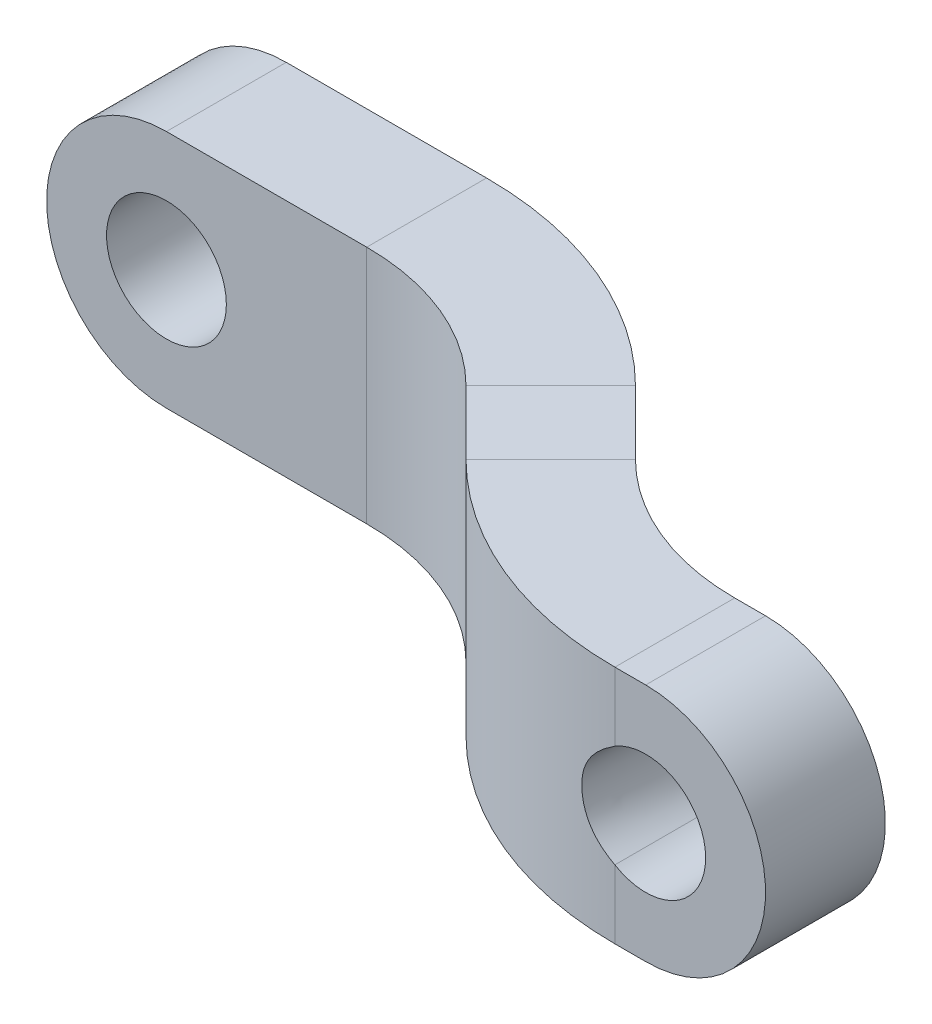
ISO-10303-21;
HEADER;
FILE_DESCRIPTION(('STEP AP214'),'2;1');
FILE_NAME('part.step','',(''),(''),'','','');
FILE_SCHEMA(('AUTOMOTIVE_DESIGN { 1 0 10303 214 1 1 1 1 }'));
ENDSEC;
DATA;
#1=APPLICATION_CONTEXT('core data for automotive mechanical design processes');
#2=APPLICATION_PROTOCOL_DEFINITION('international standard','automotive_design',2000,#1);
#3=PRODUCT_CONTEXT('',#1,'mechanical');
#4=PRODUCT('Part','Part','',(#3));
#5=PRODUCT_RELATED_PRODUCT_CATEGORY('part','',(#4));
#6=PRODUCT_DEFINITION_FORMATION('','',#4);
#7=PRODUCT_DEFINITION_CONTEXT('part definition',#1,'design');
#8=PRODUCT_DEFINITION('design','',#6,#7);
#9=PRODUCT_DEFINITION_SHAPE('','',#8);
#10=(LENGTH_UNIT() NAMED_UNIT(*) SI_UNIT(.MILLI.,.METRE.));
#11=(NAMED_UNIT(*) PLANE_ANGLE_UNIT() SI_UNIT($,.RADIAN.));
#12=(NAMED_UNIT(*) SI_UNIT($,.STERADIAN.) SOLID_ANGLE_UNIT());
#13=UNCERTAINTY_MEASURE_WITH_UNIT(LENGTH_MEASURE(1.E-05),#10,'distance_accuracy_value','');
#14=(GEOMETRIC_REPRESENTATION_CONTEXT(3) GLOBAL_UNCERTAINTY_ASSIGNED_CONTEXT((#13)) GLOBAL_UNIT_ASSIGNED_CONTEXT((#10,
#11,#12)) REPRESENTATION_CONTEXT('',''));
#15=CARTESIAN_POINT('',(0.,0.,0.));
#16=DIRECTION('',(0.,0.,1.));
#17=DIRECTION('',(1.,0.,0.));
#18=AXIS2_PLACEMENT_3D('',#15,#16,#17);
#19=CARTESIAN_POINT('',(2.57702502056479,0.,-4.92297497943529));
#20=DIRECTION('',(-0.707106781186549,0.,0.707106781186546));
#21=DIRECTION('',(0.707106781186546,0.,0.707106781186549));
#22=AXIS2_PLACEMENT_3D('',#19,#20,#21);
#23=PLANE('',#22);
#24=DIRECTION('',(0.707106781186546,0.,0.707106781186549));
#25=VECTOR('',#24,1.);
#26=CARTESIAN_POINT('',(2.57702502056479,-5.,-4.92297497943529));
#27=LINE('',#26,#25);
#28=CARTESIAN_POINT('',(15.4289321881346,-5.,7.92893218813454));
#29=VERTEX_POINT('',#28);
#30=CARTESIAN_POINT('',(18.1066017177983,-5.,10.6066017177983));
#31=VERTEX_POINT('',#30);
#32=EDGE_CURVE('E363',#29,#31,#27,.T.);
#33=ORIENTED_EDGE('',*,*,#32,.T.);
#34=DIRECTION('',(0.,1.,0.));
#35=VECTOR('',#34,1.);
#36=CARTESIAN_POINT('',(18.1066017177983,0.,10.6066017177983));
#37=LINE('',#36,#35);
#38=CARTESIAN_POINT('',(18.1066017177983,5.,10.6066017177983));
#39=VERTEX_POINT('',#38);
#40=EDGE_CURVE('E355',#31,#39,#37,.T.);
#41=ORIENTED_EDGE('',*,*,#40,.T.);
#42=DIRECTION('',(-0.707106781186546,0.,-0.707106781186549));
#43=VECTOR('',#42,1.);
#44=CARTESIAN_POINT('',(2.57702502056479,5.,-4.92297497943529));
#45=LINE('',#44,#43);
#46=CARTESIAN_POINT('',(15.4289321881346,5.,7.92893218813454));
#47=VERTEX_POINT('',#46);
#48=EDGE_CURVE('E347',#39,#47,#45,.T.);
#49=ORIENTED_EDGE('',*,*,#48,.T.);
#50=DIRECTION('',(0.,1.,0.));
#51=VECTOR('',#50,1.);
#52=CARTESIAN_POINT('',(15.4289321881346,0.,7.92893218813454));
#53=LINE('',#52,#51);
#54=EDGE_CURVE('E343',#29,#47,#53,.T.);
#55=ORIENTED_EDGE('',*,*,#54,.F.);
#56=EDGE_LOOP('',(#33,#41,#49,#55));
#57=FACE_BOUND('',#56,.T.);
#58=ADVANCED_FACE('F50',(#57),#23,.T.);
#59=CARTESIAN_POINT('',(2.57702502056479,-5.,-4.92297497943529));
#60=DIRECTION('',(0.,-1.,0.));
#61=DIRECTION('',(0.707106781186546,0.,0.707106781186549));
#62=AXIS2_PLACEMENT_3D('',#59,#60,#61);
#63=PLANE('',#62);
#64=DIRECTION('',(0.707106781186546,0.,0.707106781186549));
#65=VECTOR('',#64,1.);
#66=CARTESIAN_POINT('',(6.11255892649753,-5.,-8.45850888536802));
#67=LINE('',#66,#65);
#68=CARTESIAN_POINT('',(18.9644660940673,-5.,4.39339828220181));
#69=VERTEX_POINT('',#68);
#70=CARTESIAN_POINT('',(21.642135623731,-5.,7.07106781186553));
#71=VERTEX_POINT('',#70);
#72=EDGE_CURVE('E73',#69,#71,#67,.T.);
#73=ORIENTED_EDGE('',*,*,#72,.T.);
#74=DIRECTION('',(-0.707106781186549,0.,0.707106781186546));
#75=VECTOR('',#74,1.);
#76=CARTESIAN_POINT('',(18.1066017177983,-5.,10.6066017177983));
#77=LINE('',#76,#75);
#78=EDGE_CURVE('E358',#71,#31,#77,.T.);
#79=ORIENTED_EDGE('',*,*,#78,.T.);
#80=ORIENTED_EDGE('',*,*,#32,.F.);
#81=DIRECTION('',(-0.707106781186549,0.,0.707106781186546));
#82=VECTOR('',#81,1.);
#83=CARTESIAN_POINT('',(15.4289321881346,-5.,7.92893218813454));
#84=LINE('',#83,#82);
#85=EDGE_CURVE('E352',#69,#29,#84,.T.);
#86=ORIENTED_EDGE('',*,*,#85,.F.);
#87=EDGE_LOOP('',(#73,#79,#80,#86));
#88=FACE_BOUND('',#87,.T.);
#89=ADVANCED_FACE('F52',(#88),#63,.T.);
#90=CARTESIAN_POINT('',(2.57702502056479,5.,-4.92297497943529));
#91=DIRECTION('',(0.,1.,0.));
#92=DIRECTION('',(-0.707106781186546,0.,-0.707106781186549));
#93=AXIS2_PLACEMENT_3D('',#90,#91,#92);
#94=PLANE('',#93);
#95=ORIENTED_EDGE('',*,*,#48,.F.);
#96=DIRECTION('',(0.707106781186549,0.,-0.707106781186546));
#97=VECTOR('',#96,1.);
#98=CARTESIAN_POINT('',(18.1066017177983,5.,10.6066017177983));
#99=LINE('',#98,#97);
#100=CARTESIAN_POINT('',(21.642135623731,5.,7.07106781186552));
#101=VERTEX_POINT('',#100);
#102=EDGE_CURVE('E12',#39,#101,#99,.T.);
#103=ORIENTED_EDGE('',*,*,#102,.T.);
#104=DIRECTION('',(0.707106781186546,0.,0.707106781186549));
#105=VECTOR('',#104,1.);
#106=CARTESIAN_POINT('',(6.11255892649753,5.,-8.45850888536802));
#107=LINE('',#106,#105);
#108=CARTESIAN_POINT('',(18.9644660940673,5.,4.39339828220181));
#109=VERTEX_POINT('',#108);
#110=EDGE_CURVE('E308',#101,#109,#107,.F.);
#111=ORIENTED_EDGE('',*,*,#110,.T.);
#112=DIRECTION('',(0.707106781186549,0.,-0.707106781186546));
#113=VECTOR('',#112,1.);
#114=CARTESIAN_POINT('',(15.4289321881346,5.,7.92893218813454));
#115=LINE('',#114,#113);
#116=EDGE_CURVE('E346',#47,#109,#115,.T.);
#117=ORIENTED_EDGE('',*,*,#116,.F.);
#118=EDGE_LOOP('',(#95,#103,#111,#117));
#119=FACE_BOUND('',#118,.T.);
#120=ADVANCED_FACE('F440',(#119),#94,.T.);
#121=CARTESIAN_POINT('',(6.11255892649753,0.,-8.45850888536802));
#122=DIRECTION('',(-0.707106781186549,0.,0.707106781186546));
#123=DIRECTION('',(0.707106781186546,0.,0.707106781186549));
#124=AXIS2_PLACEMENT_3D('',#121,#122,#123);
#125=PLANE('',#124);
#126=DIRECTION('',(0.,1.,0.));
#127=VECTOR('',#126,1.);
#128=CARTESIAN_POINT('',(21.642135623731,0.,7.07106781186553));
#129=LINE('',#128,#127);
#130=EDGE_CURVE('E59',#71,#101,#129,.T.);
#131=ORIENTED_EDGE('',*,*,#130,.F.);
#132=ORIENTED_EDGE('',*,*,#72,.F.);
#133=DIRECTION('',(0.,1.,0.));
#134=VECTOR('',#133,1.);
#135=CARTESIAN_POINT('',(18.9644660940673,0.,4.39339828220181));
#136=LINE('',#135,#134);
#137=EDGE_CURVE('E350',#69,#109,#136,.T.);
#138=ORIENTED_EDGE('',*,*,#137,.T.);
#139=ORIENTED_EDGE('',*,*,#110,.F.);
#140=EDGE_LOOP('',(#131,#132,#138,#139));
#141=FACE_BOUND('',#140,.T.);
#142=ADVANCED_FACE('F437',(#141),#125,.F.);
#143=CARTESIAN_POINT('',(0.,0.,5.));
#144=DIRECTION('',(0.,0.,1.));
#145=DIRECTION('',(1.,0.,0.));
#146=AXIS2_PLACEMENT_3D('',#143,#144,#145);
#147=CYLINDRICAL_SURFACE('',#146,5.);
#148=DIRECTION('',(0.,0.,1.));
#149=VECTOR('',#148,1.);
#150=CARTESIAN_POINT('',(0.,5.,5.));
#151=LINE('',#150,#149);
#152=CARTESIAN_POINT('',(0.,5.,0.));
#153=VERTEX_POINT('',#152);
#154=CARTESIAN_POINT('',(0.,5.,5.));
#155=VERTEX_POINT('',#154);
#156=EDGE_CURVE('E315',#153,#155,#151,.T.);
#157=ORIENTED_EDGE('',*,*,#156,.F.);
#158=CARTESIAN_POINT('',(0.,0.,0.));
#159=DIRECTION('',(0.,0.,1.));
#160=DIRECTION('',(1.,0.,0.));
#161=AXIS2_PLACEMENT_3D('',#158,#159,#160);
#162=CIRCLE('',#161,5.);
#163=CARTESIAN_POINT('',(0.,-5.,0.));
#164=VERTEX_POINT('',#163);
#165=EDGE_CURVE('E339',#153,#164,#162,.T.);
#166=ORIENTED_EDGE('',*,*,#165,.T.);
#167=DIRECTION('',(0.,0.,1.));
#168=VECTOR('',#167,1.);
#169=CARTESIAN_POINT('',(0.,-5.,5.));
#170=LINE('',#169,#168);
#171=CARTESIAN_POINT('',(0.,-5.,5.));
#172=VERTEX_POINT('',#171);
#173=EDGE_CURVE('E337',#164,#172,#170,.T.);
#174=ORIENTED_EDGE('',*,*,#173,.T.);
#175=CARTESIAN_POINT('',(0.,0.,5.));
#176=DIRECTION('',(0.,0.,1.));
#177=DIRECTION('',(1.,0.,0.));
#178=AXIS2_PLACEMENT_3D('',#175,#176,#177);
#179=CIRCLE('',#178,5.);
#180=EDGE_CURVE('E323',#155,#172,#179,.T.);
#181=ORIENTED_EDGE('',*,*,#180,.F.);
#182=EDGE_LOOP('',(#157,#166,#174,#181));
#183=FACE_BOUND('',#182,.T.);
#184=ADVANCED_FACE('F471',(#183),#147,.T.);
#185=CARTESIAN_POINT('',(0.,0.,5.));
#186=DIRECTION('',(0.,0.,1.));
#187=DIRECTION('',(1.,0.,0.));
#188=AXIS2_PLACEMENT_3D('',#185,#186,#187);
#189=CYLINDRICAL_SURFACE('',#188,2.5);
#190=CARTESIAN_POINT('',(0.,0.,5.));
#191=DIRECTION('',(0.,0.,1.));
#192=DIRECTION('',(1.,0.,0.));
#193=AXIS2_PLACEMENT_3D('',#190,#191,#192);
#194=CIRCLE('',#193,2.5);
#195=CARTESIAN_POINT('',(2.5,0.,5.));
#196=VERTEX_POINT('',#195);
#197=EDGE_CURVE('E334',#196,#196,#194,.T.);
#198=ORIENTED_EDGE('',*,*,#197,.T.);
#199=EDGE_LOOP('',(#198));
#200=FACE_BOUND('',#199,.T.);
#201=CARTESIAN_POINT('',(0.,0.,0.));
#202=DIRECTION('',(0.,0.,1.));
#203=DIRECTION('',(1.,0.,0.));
#204=AXIS2_PLACEMENT_3D('',#201,#202,#203);
#205=CIRCLE('',#204,2.5);
#206=CARTESIAN_POINT('',(2.5,0.,0.));
#207=VERTEX_POINT('',#206);
#208=EDGE_CURVE('E312',#207,#207,#205,.T.);
#209=ORIENTED_EDGE('',*,*,#208,.F.);
#210=EDGE_LOOP('',(#209));
#211=FACE_BOUND('',#210,.T.);
#212=ADVANCED_FACE('F473',(#200,#211),#189,.F.);
#213=CARTESIAN_POINT('',(0.,0.,5.));
#214=DIRECTION('',(0.,0.,1.));
#215=DIRECTION('',(1.,0.,0.));
#216=AXIS2_PLACEMENT_3D('',#213,#214,#215);
#217=PLANE('',#216);
#218=ORIENTED_EDGE('',*,*,#197,.F.);
#219=EDGE_LOOP('',(#218));
#220=FACE_BOUND('',#219,.T.);
#221=DIRECTION('',(1.,0.,0.));
#222=VECTOR('',#221,1.);
#223=CARTESIAN_POINT('',(0.,-5.,5.));
#224=LINE('',#223,#222);
#225=CARTESIAN_POINT('',(8.35786437626909,-5.,5.));
#226=VERTEX_POINT('',#225);
#227=EDGE_CURVE('E331',#172,#226,#224,.T.);
#228=ORIENTED_EDGE('',*,*,#227,.T.);
#229=DIRECTION('',(0.,1.,0.));
#230=VECTOR('',#229,1.);
#231=CARTESIAN_POINT('',(8.35786437626908,0.,5.));
#232=LINE('',#231,#230);
#233=CARTESIAN_POINT('',(8.35786437626908,5.,5.));
#234=VERTEX_POINT('',#233);
#235=EDGE_CURVE('E328',#226,#234,#232,.T.);
#236=ORIENTED_EDGE('',*,*,#235,.T.);
#237=DIRECTION('',(-1.,0.,0.));
#238=VECTOR('',#237,1.);
#239=CARTESIAN_POINT('',(0.,5.,5.));
#240=LINE('',#239,#238);
#241=EDGE_CURVE('E326',#234,#155,#240,.T.);
#242=ORIENTED_EDGE('',*,*,#241,.T.);
#243=ORIENTED_EDGE('',*,*,#180,.T.);
#244=EDGE_LOOP('',(#228,#236,#242,#243));
#245=FACE_BOUND('',#244,.T.);
#246=ADVANCED_FACE('F455',(#220,#245),#217,.T.);
#247=CARTESIAN_POINT('',(0.,5.,5.));
#248=DIRECTION('',(0.,1.,0.));
#249=DIRECTION('',(-1.,0.,0.));
#250=AXIS2_PLACEMENT_3D('',#247,#248,#249);
#251=PLANE('',#250);
#252=ORIENTED_EDGE('',*,*,#241,.F.);
#253=DIRECTION('',(0.,0.,-1.));
#254=VECTOR('',#253,1.);
#255=CARTESIAN_POINT('',(8.35786437626908,5.,5.));
#256=LINE('',#255,#254);
#257=CARTESIAN_POINT('',(8.35786437626908,5.,0.));
#258=VERTEX_POINT('',#257);
#259=EDGE_CURVE('E320',#234,#258,#256,.T.);
#260=ORIENTED_EDGE('',*,*,#259,.T.);
#261=DIRECTION('',(1.,0.,0.));
#262=VECTOR('',#261,1.);
#263=CARTESIAN_POINT('',(0.,5.,0.));
#264=LINE('',#263,#262);
#265=EDGE_CURVE('E318',#258,#153,#264,.F.);
#266=ORIENTED_EDGE('',*,*,#265,.T.);
#267=ORIENTED_EDGE('',*,*,#156,.T.);
#268=EDGE_LOOP('',(#252,#260,#266,#267));
#269=FACE_BOUND('',#268,.T.);
#270=ADVANCED_FACE('F451',(#269),#251,.T.);
#271=CARTESIAN_POINT('',(0.,0.,0.));
#272=DIRECTION('',(0.,0.,1.));
#273=DIRECTION('',(1.,0.,0.));
#274=AXIS2_PLACEMENT_3D('',#271,#272,#273);
#275=PLANE('',#274);
#276=DIRECTION('',(0.,1.,0.));
#277=VECTOR('',#276,1.);
#278=CARTESIAN_POINT('',(8.35786437626908,0.,0.));
#279=LINE('',#278,#277);
#280=CARTESIAN_POINT('',(8.35786437626909,-5.,0.));
#281=VERTEX_POINT('',#280);
#282=EDGE_CURVE('E300',#281,#258,#279,.T.);
#283=ORIENTED_EDGE('',*,*,#282,.F.);
#284=DIRECTION('',(1.,0.,0.));
#285=VECTOR('',#284,1.);
#286=CARTESIAN_POINT('',(0.,-5.,0.));
#287=LINE('',#286,#285);
#288=EDGE_CURVE('E309',#164,#281,#287,.T.);
#289=ORIENTED_EDGE('',*,*,#288,.F.);
#290=ORIENTED_EDGE('',*,*,#165,.F.);
#291=ORIENTED_EDGE('',*,*,#265,.F.);
#292=EDGE_LOOP('',(#283,#289,#290,#291));
#293=FACE_BOUND('',#292,.T.);
#294=ORIENTED_EDGE('',*,*,#208,.T.);
#295=EDGE_LOOP('',(#294));
#296=FACE_BOUND('',#295,.T.);
#297=ADVANCED_FACE('F467',(#293,#296),#275,.F.);
#298=CARTESIAN_POINT('',(0.,-5.,5.));
#299=DIRECTION('',(0.,-1.,0.));
#300=DIRECTION('',(1.,0.,0.));
#301=AXIS2_PLACEMENT_3D('',#298,#299,#300);
#302=PLANE('',#301);
#303=ORIENTED_EDGE('',*,*,#288,.T.);
#304=DIRECTION('',(0.,0.,1.));
#305=VECTOR('',#304,1.);
#306=CARTESIAN_POINT('',(8.35786437626908,-5.,5.));
#307=LINE('',#306,#305);
#308=EDGE_CURVE('E305',#281,#226,#307,.T.);
#309=ORIENTED_EDGE('',*,*,#308,.T.);
#310=ORIENTED_EDGE('',*,*,#227,.F.);
#311=ORIENTED_EDGE('',*,*,#173,.F.);
#312=EDGE_LOOP('',(#303,#309,#310,#311));
#313=FACE_BOUND('',#312,.T.);
#314=ADVANCED_FACE('F458',(#313),#302,.T.);
#315=CARTESIAN_POINT('',(8.35786437626908,-5.,15.));
#316=DIRECTION('',(0.,1.,0.));
#317=DIRECTION('',(0.,0.,1.));
#318=AXIS2_PLACEMENT_3D('',#315,#316,#317);
#319=PLANE('',#318);
#320=ORIENTED_EDGE('',*,*,#308,.F.);
#321=CARTESIAN_POINT('',(8.35786437626908,-5.,15.));
#322=DIRECTION('',(0.,1.,0.));
#323=DIRECTION('',(-1.,0.,0.));
#324=AXIS2_PLACEMENT_3D('',#321,#322,#323);
#325=CIRCLE('',#324,15.);
#326=EDGE_CURVE('E203',#281,#69,#325,.F.);
#327=ORIENTED_EDGE('',*,*,#326,.T.);
#328=ORIENTED_EDGE('',*,*,#85,.T.);
#329=CARTESIAN_POINT('',(8.35786437626908,-5.,15.));
#330=DIRECTION('',(0.,-1.,0.));
#331=DIRECTION('',(0.,0.,-1.));
#332=AXIS2_PLACEMENT_3D('',#329,#330,#331);
#333=CIRCLE('',#332,10.);
#334=EDGE_CURVE('E288',#226,#29,#333,.T.);
#335=ORIENTED_EDGE('',*,*,#334,.F.);
#336=EDGE_LOOP('',(#320,#327,#328,#335));
#337=FACE_BOUND('',#336,.T.);
#338=ADVANCED_FACE('F463',(#337),#319,.F.);
#339=CARTESIAN_POINT('',(8.35786437626908,5.,15.));
#340=DIRECTION('',(0.,-1.,0.));
#341=DIRECTION('',(0.,0.,-1.));
#342=AXIS2_PLACEMENT_3D('',#339,#340,#341);
#343=PLANE('',#342);
#344=ORIENTED_EDGE('',*,*,#116,.T.);
#345=CARTESIAN_POINT('',(8.35786437626908,5.,15.));
#346=DIRECTION('',(0.,1.,0.));
#347=DIRECTION('',(-1.,0.,0.));
#348=AXIS2_PLACEMENT_3D('',#345,#346,#347);
#349=CIRCLE('',#348,15.);
#350=EDGE_CURVE('E297',#109,#258,#349,.T.);
#351=ORIENTED_EDGE('',*,*,#350,.T.);
#352=ORIENTED_EDGE('',*,*,#259,.F.);
#353=CARTESIAN_POINT('',(8.35786437626908,5.,15.));
#354=DIRECTION('',(0.,1.,0.));
#355=DIRECTION('',(0.,0.,1.));
#356=AXIS2_PLACEMENT_3D('',#353,#354,#355);
#357=CIRCLE('',#356,10.);
#358=EDGE_CURVE('E296',#47,#234,#357,.T.);
#359=ORIENTED_EDGE('',*,*,#358,.F.);
#360=EDGE_LOOP('',(#344,#351,#352,#359));
#361=FACE_BOUND('',#360,.T.);
#362=ADVANCED_FACE('F446',(#361),#343,.F.);
#363=CARTESIAN_POINT('',(8.35786437626908,-14.8789399985143,15.));
#364=DIRECTION('',(0.,1.,0.));
#365=DIRECTION('',(-1.,0.,0.));
#366=AXIS2_PLACEMENT_3D('',#363,#364,#365);
#367=CYLINDRICAL_SURFACE('',#366,10.);
#368=ORIENTED_EDGE('',*,*,#358,.T.);
#369=ORIENTED_EDGE('',*,*,#235,.F.);
#370=ORIENTED_EDGE('',*,*,#334,.T.);
#371=ORIENTED_EDGE('',*,*,#54,.T.);
#372=EDGE_LOOP('',(#368,#369,#370,#371));
#373=FACE_BOUND('',#372,.T.);
#374=ADVANCED_FACE('F443',(#373),#367,.F.);
#375=CARTESIAN_POINT('',(8.35786437626908,-14.8789399985143,15.));
#376=DIRECTION('',(0.,1.,0.));
#377=DIRECTION('',(-1.,0.,0.));
#378=AXIS2_PLACEMENT_3D('',#375,#376,#377);
#379=CYLINDRICAL_SURFACE('',#378,15.);
#380=ORIENTED_EDGE('',*,*,#350,.F.);
#381=ORIENTED_EDGE('',*,*,#137,.F.);
#382=ORIENTED_EDGE('',*,*,#326,.F.);
#383=ORIENTED_EDGE('',*,*,#282,.T.);
#384=EDGE_LOOP('',(#380,#381,#382,#383));
#385=FACE_BOUND('',#384,.T.);
#386=ADVANCED_FACE('F465',(#385),#379,.T.);
#387=CARTESIAN_POINT('',(28.7132034355965,-5.,0.));
#388=DIRECTION('',(0.,-1.,0.));
#389=DIRECTION('',(0.,0.,-1.));
#390=AXIS2_PLACEMENT_3D('',#387,#388,#389);
#391=PLANE('',#390);
#392=ORIENTED_EDGE('',*,*,#78,.F.);
#393=CARTESIAN_POINT('',(28.7132034355965,-5.,0.));
#394=DIRECTION('',(0.,1.,0.));
#395=DIRECTION('',(-1.,0.,0.));
#396=AXIS2_PLACEMENT_3D('',#393,#394,#395);
#397=CIRCLE('',#396,10.);
#398=CARTESIAN_POINT('',(28.7132034355965,-5.,10.0000000000001));
#399=VERTEX_POINT('',#398);
#400=EDGE_CURVE('E176',#71,#399,#397,.T.);
#401=ORIENTED_EDGE('',*,*,#400,.T.);
#402=DIRECTION('',(0.,0.,1.));
#403=VECTOR('',#402,1.);
#404=CARTESIAN_POINT('',(28.7132034355965,-5.,15.0000000000001));
#405=LINE('',#404,#403);
#406=CARTESIAN_POINT('',(28.7132034355965,-5.,15.0000000000001));
#407=VERTEX_POINT('',#406);
#408=EDGE_CURVE('E162',#399,#407,#405,.T.);
#409=ORIENTED_EDGE('',*,*,#408,.T.);
#410=CARTESIAN_POINT('',(28.7132034355965,-5.,0.));
#411=DIRECTION('',(0.,1.,0.));
#412=DIRECTION('',(0.,0.,1.));
#413=AXIS2_PLACEMENT_3D('',#410,#411,#412);
#414=CIRCLE('',#413,15.);
#415=EDGE_CURVE('E195',#31,#407,#414,.T.);
#416=ORIENTED_EDGE('',*,*,#415,.F.);
#417=EDGE_LOOP('',(#392,#401,#409,#416));
#418=FACE_BOUND('',#417,.T.);
#419=ADVANCED_FACE('F262',(#418),#391,.T.);
#420=CARTESIAN_POINT('',(28.7132034355965,-2.14339791029087,15.0000000000001));
#421=CARTESIAN_POINT('',(28.2275167462207,-1.89037995575477,15.0000000000001));
#422=CARTESIAN_POINT('',(27.8639054932689,-1.58544875984548,14.9778990853626));
#423=CARTESIAN_POINT('',(27.501237034779,-1.04999394436314,14.9514490750839));
#424=CARTESIAN_POINT('',(27.4107703328523,-0.858509788908112,14.9434707445677));
#425=CARTESIAN_POINT('',(27.3205236395993,-0.55178473028418,14.9352387143976));
#426=CARTESIAN_POINT('',(27.2980173702974,-0.446293239835975,14.9330999341023));
#427=CARTESIAN_POINT('',(27.2756078598306,-0.283181297803318,14.9309535954964));
#428=CARTESIAN_POINT('',(27.2700297570161,-0.22799819939904,14.9304140416442));
#429=CARTESIAN_POINT('',(27.2644992901052,-0.144004875202539,14.9298780882232));
#430=CARTESIAN_POINT('',(27.2631285886024,-0.115803987705358,14.9297449325851));
#431=CARTESIAN_POINT('',(27.2613326848163,-0.0589959871809667,14.9295703935835));
#432=CARTESIAN_POINT('',(27.2609128816966,-0.0271165503110795,14.9295295354156));
#433=CARTESIAN_POINT('',(27.2616291993632,0.407027782831231,14.9295992141627));
#434=CARTESIAN_POINT('',(27.3825015749911,0.790079044981979,14.9428243837746));
#435=CARTESIAN_POINT('',(27.8660645983879,1.50507123119944,14.9780213578643));
#436=CARTESIAN_POINT('',(28.2289663271761,1.83696646358107,15.0000000000001));
#437=CARTESIAN_POINT('',(28.7132034355965,2.14339791029086,15.0000000000001));
#438=CARTESIAN_POINT('',(28.7132034355965,-2.14339791029088,10.0000000000001));
#439=CARTESIAN_POINT('',(28.3894235796052,-1.89038876259876,10.0000000000001));
#440=CARTESIAN_POINT('',(28.1470048073781,-1.58544875984548,9.98526605690842));
#441=CARTESIAN_POINT('',(27.9052258350515,-1.04999394436315,9.96763271672263));
#442=CARTESIAN_POINT('',(27.8449147004337,-0.858509788908113,9.96231382971182));
#443=CARTESIAN_POINT('',(27.784750238265,-0.551784730284181,9.95682580959843));
#444=CARTESIAN_POINT('',(27.7697460587304,-0.446293239835976,9.95539995606824));
#445=CARTESIAN_POINT('',(27.7548063850859,-0.283181297803319,9.95396906366426));
#446=CARTESIAN_POINT('',(27.7510876498762,-0.227998199399042,9.95360936109615));
#447=CARTESIAN_POINT('',(27.7474006719356,-0.14400487520254,9.95325205881546));
#448=CARTESIAN_POINT('',(27.7464868709338,-0.115803987705359,9.95316328839009));
#449=CARTESIAN_POINT('',(27.745289601743,-0.0589959871809679,9.95304692905567));
#450=CARTESIAN_POINT('',(27.7450097329965,-0.0271165503110807,9.9530196902771));
#451=CARTESIAN_POINT('',(27.7454872781076,0.40702778283123,9.95306614277514));
#452=CARTESIAN_POINT('',(27.8260688618596,0.790079044981978,9.96188292251642));
#453=CARTESIAN_POINT('',(28.1484442107908,1.50507123119944,9.98534757190958));
#454=CARTESIAN_POINT('',(28.3903913715677,1.83697849485699,10.0000000000001));
#455=CARTESIAN_POINT('',(28.7132034355965,2.14339791029086,10.0000000000001));
#456=B_SPLINE_SURFACE_WITH_KNOTS('',1,3,((#420,#421,#422,#423,#424,#425,#426,#427,#428,#429,
#430,#431,#432,#433,#434,#435,#436,#437),(#438,#439,#440,#441,#442,#443,#444,#445,#446,#447,
#448,#449,#450,#451,#452,#453,#454,#455)),.UNSPECIFIED.,.F.,.F.,.F.,(2,2),(4,2,2,2,2,2,2,2,4),
(0.,1.),(0.,0.25,0.375,0.4375,0.46875,0.484375,0.5,0.75,1.),.UNSPECIFIED.);
#457=CARTESIAN_POINT('',(28.7132034355965,-2.14339791029087,15.0000000000001));
#458=CARTESIAN_POINT('',(28.7132034355965,-2.14339791029088,10.0000000000001));
#459=B_SPLINE_CURVE_WITH_KNOTS('',1,(#457,#458),.UNSPECIFIED.,.F.,.F.,(2,2),(0.,1.),.UNSPECIFIED.);
#460=CARTESIAN_POINT('',(28.7132034355965,-2.14339791029087,15.0000000000001));
#461=VERTEX_POINT('',#460);
#462=CARTESIAN_POINT('',(28.7132034355965,-2.14339791029087,10.0000000000001));
#463=VERTEX_POINT('',#462);
#464=EDGE_CURVE('E194',#461,#463,#459,.T.);
#465=CARTESIAN_POINT('',(28.7132034355965,-2.14339791029088,10.0000000000001));
#466=CARTESIAN_POINT('',(28.3894235796052,-1.89038876259876,10.0000000000001));
#467=CARTESIAN_POINT('',(28.1470048073781,-1.58544875984548,9.98526605690842));
#468=CARTESIAN_POINT('',(27.9052258350515,-1.04999394436315,9.96763271672263));
#469=CARTESIAN_POINT('',(27.8449147004337,-0.858509788908113,9.96231382971182));
#470=CARTESIAN_POINT('',(27.784750238265,-0.551784730284181,9.95682580959843));
#471=CARTESIAN_POINT('',(27.7697460587304,-0.446293239835976,9.95539995606824));
#472=CARTESIAN_POINT('',(27.7548063850859,-0.283181297803319,9.95396906366426));
#473=CARTESIAN_POINT('',(27.7510876498762,-0.227998199399042,9.95360936109615));
#474=CARTESIAN_POINT('',(27.7474006719356,-0.14400487520254,9.95325205881546));
#475=CARTESIAN_POINT('',(27.7464868709338,-0.115803987705359,9.95316328839009));
#476=CARTESIAN_POINT('',(27.745289601743,-0.0589959871809679,9.95304692905567));
#477=CARTESIAN_POINT('',(27.7450097329965,-0.0271165503110807,9.9530196902771));
#478=CARTESIAN_POINT('',(27.7454872781076,0.40702778283123,9.95306614277514));
#479=CARTESIAN_POINT('',(27.8260688618596,0.790079044981978,9.96188292251642));
#480=CARTESIAN_POINT('',(28.1484442107908,1.50507123119944,9.98534757190958));
#481=CARTESIAN_POINT('',(28.3903913715677,1.83697849485699,10.0000000000001));
#482=CARTESIAN_POINT('',(28.7132034355965,2.14339791029086,10.0000000000001));
#483=B_SPLINE_CURVE_WITH_KNOTS('',3,(#465,#466,#467,#468,#469,#470,#471,#472,#473,#474,#475,
#476,#477,#478,#479,#480,#481,#482),.UNSPECIFIED.,.F.,.F.,(4,2,2,2,2,2,2,2,4),(0.,0.25,0.375,
0.4375,0.46875,0.484375,0.5,0.75,1.),.UNSPECIFIED.);
#484=CARTESIAN_POINT('',(28.7132034355965,2.14339791029087,10.0000000000001));
#485=VERTEX_POINT('',#484);
#486=EDGE_CURVE('E205',#463,#485,#483,.T.);
#487=CARTESIAN_POINT('',(28.7132034355965,2.14339791029086,10.0000000000001));
#488=CARTESIAN_POINT('',(28.7132034355965,2.14339791029086,15.0000000000001));
#489=B_SPLINE_CURVE_WITH_KNOTS('',1,(#487,#488),.UNSPECIFIED.,.F.,.F.,(2,2),(0.,1.),.UNSPECIFIED.);
#490=CARTESIAN_POINT('',(28.7132034355965,2.14339791029087,15.0000000000001));
#491=VERTEX_POINT('',#490);
#492=EDGE_CURVE('E182',#485,#491,#489,.T.);
#493=CARTESIAN_POINT('',(28.7132034355965,2.14339791029086,15.0000000000001));
#494=CARTESIAN_POINT('',(28.2289663271761,1.83696646358107,15.0000000000001));
#495=CARTESIAN_POINT('',(27.8660645983879,1.50507123119944,14.9780213578643));
#496=CARTESIAN_POINT('',(27.3825015749911,0.790079044981979,14.9428243837746));
#497=CARTESIAN_POINT('',(27.2616291993632,0.407027782831231,14.9295992141627));
#498=CARTESIAN_POINT('',(27.2609128816966,-0.0271165503110795,14.9295295354156));
#499=CARTESIAN_POINT('',(27.2613326848163,-0.0589959871809667,14.9295703935835));
#500=CARTESIAN_POINT('',(27.2631285886024,-0.115803987705358,14.9297449325851));
#501=CARTESIAN_POINT('',(27.2644992901052,-0.144004875202539,14.9298780882232));
#502=CARTESIAN_POINT('',(27.2700297570161,-0.22799819939904,14.9304140416442));
#503=CARTESIAN_POINT('',(27.2756078598306,-0.283181297803318,14.9309535954964));
#504=CARTESIAN_POINT('',(27.2980173702974,-0.446293239835975,14.9330999341023));
#505=CARTESIAN_POINT('',(27.3205236395993,-0.55178473028418,14.9352387143976));
#506=CARTESIAN_POINT('',(27.4107703328523,-0.858509788908112,14.9434707445677));
#507=CARTESIAN_POINT('',(27.501237034779,-1.04999394436314,14.9514490750839));
#508=CARTESIAN_POINT('',(27.8639054932689,-1.58544875984548,14.9778990853626));
#509=CARTESIAN_POINT('',(28.2275167462207,-1.89037995575477,15.0000000000001));
#510=CARTESIAN_POINT('',(28.7132034355965,-2.14339791029087,15.0000000000001));
#511=B_SPLINE_CURVE_WITH_KNOTS('',3,(#493,#494,#495,#496,#497,#498,#499,#500,#501,#502,#503,
#504,#505,#506,#507,#508,#509,#510),.UNSPECIFIED.,.F.,.F.,(4,2,2,2,2,2,2,2,4),(0.,0.25,0.5,
0.515625,0.53125,0.5625,0.625,0.75,1.),.UNSPECIFIED.);
#512=EDGE_CURVE('E198',#461,#491,#511,.F.);
#513=ORIENTED_EDGE('',*,*,#464,.T.);
#514=ORIENTED_EDGE('',*,*,#486,.T.);
#515=ORIENTED_EDGE('',*,*,#492,.T.);
#516=ORIENTED_EDGE('',*,*,#512,.F.);
#517=EDGE_LOOP('',(#513,#514,#515,#516));
#518=FACE_BOUND('',#517,.T.);
#519=ADVANCED_FACE('F251',(#518),#456,.T.);
#520=CARTESIAN_POINT('',(28.7132034355965,5.,0.));
#521=DIRECTION('',(0.,1.,0.));
#522=DIRECTION('',(0.,0.,1.));
#523=AXIS2_PLACEMENT_3D('',#520,#521,#522);
#524=PLANE('',#523);
#525=DIRECTION('',(0.,0.,-1.));
#526=VECTOR('',#525,1.);
#527=CARTESIAN_POINT('',(28.7132034355965,5.,15.0000000000001));
#528=LINE('',#527,#526);
#529=CARTESIAN_POINT('',(28.7132034355965,5.,15.0000000000001));
#530=VERTEX_POINT('',#529);
#531=CARTESIAN_POINT('',(28.7132034355965,5.,10.0000000000001));
#532=VERTEX_POINT('',#531);
#533=EDGE_CURVE('E187',#530,#532,#528,.T.);
#534=ORIENTED_EDGE('',*,*,#533,.T.);
#535=CARTESIAN_POINT('',(28.7132034355965,5.,0.));
#536=DIRECTION('',(0.,1.,0.));
#537=DIRECTION('',(-1.,0.,0.));
#538=AXIS2_PLACEMENT_3D('',#535,#536,#537);
#539=CIRCLE('',#538,10.);
#540=EDGE_CURVE('E199',#532,#101,#539,.F.);
#541=ORIENTED_EDGE('',*,*,#540,.T.);
#542=ORIENTED_EDGE('',*,*,#102,.F.);
#543=CARTESIAN_POINT('',(28.7132034355965,5.,0.));
#544=DIRECTION('',(0.,-1.,0.));
#545=DIRECTION('',(0.,0.,-1.));
#546=AXIS2_PLACEMENT_3D('',#543,#544,#545);
#547=CIRCLE('',#546,15.);
#548=EDGE_CURVE('E200',#530,#39,#547,.T.);
#549=ORIENTED_EDGE('',*,*,#548,.F.);
#550=EDGE_LOOP('',(#534,#541,#542,#549));
#551=FACE_BOUND('',#550,.T.);
#552=ADVANCED_FACE('F225',(#551),#524,.T.);
#553=CARTESIAN_POINT('',(28.7132034355965,-17.876174811857,0.));
#554=DIRECTION('',(0.,1.,0.));
#555=DIRECTION('',(-1.,0.,0.));
#556=AXIS2_PLACEMENT_3D('',#553,#554,#555);
#557=CYLINDRICAL_SURFACE('',#556,15.);
#558=ORIENTED_EDGE('',*,*,#548,.T.);
#559=ORIENTED_EDGE('',*,*,#40,.F.);
#560=ORIENTED_EDGE('',*,*,#415,.T.);
#561=DIRECTION('',(0.,1.,0.));
#562=VECTOR('',#561,1.);
#563=CARTESIAN_POINT('',(28.7132034355965,0.,15.0000000000001));
#564=LINE('',#563,#562);
#565=EDGE_CURVE('E376',#407,#461,#564,.T.);
#566=ORIENTED_EDGE('',*,*,#565,.T.);
#567=ORIENTED_EDGE('',*,*,#512,.T.);
#568=DIRECTION('',(0.,1.,0.));
#569=VECTOR('',#568,1.);
#570=CARTESIAN_POINT('',(28.7132034355965,0.,15.0000000000001));
#571=LINE('',#570,#569);
#572=EDGE_CURVE('E192',#491,#530,#571,.T.);
#573=ORIENTED_EDGE('',*,*,#572,.T.);
#574=EDGE_LOOP('',(#558,#559,#560,#566,#567,#573));
#575=FACE_BOUND('',#574,.T.);
#576=ADVANCED_FACE('F214',(#575),#557,.T.);
#577=CARTESIAN_POINT('',(28.7132034355965,-17.876174811857,0.));
#578=DIRECTION('',(0.,1.,0.));
#579=DIRECTION('',(-1.,0.,0.));
#580=AXIS2_PLACEMENT_3D('',#577,#578,#579);
#581=CYLINDRICAL_SURFACE('',#580,10.);
#582=ORIENTED_EDGE('',*,*,#540,.F.);
#583=DIRECTION('',(0.,1.,0.));
#584=VECTOR('',#583,1.);
#585=CARTESIAN_POINT('',(28.7132034355965,0.,10.0000000000001));
#586=LINE('',#585,#584);
#587=EDGE_CURVE('E383',#485,#532,#586,.T.);
#588=ORIENTED_EDGE('',*,*,#587,.F.);
#589=ORIENTED_EDGE('',*,*,#486,.F.);
#590=DIRECTION('',(0.,1.,0.));
#591=VECTOR('',#590,1.);
#592=CARTESIAN_POINT('',(28.7132034355965,0.,10.0000000000001));
#593=LINE('',#592,#591);
#594=EDGE_CURVE('E372',#399,#463,#593,.T.);
#595=ORIENTED_EDGE('',*,*,#594,.F.);
#596=ORIENTED_EDGE('',*,*,#400,.F.);
#597=ORIENTED_EDGE('',*,*,#130,.T.);
#598=EDGE_LOOP('',(#582,#588,#589,#595,#596,#597));
#599=FACE_BOUND('',#598,.T.);
#600=ADVANCED_FACE('F224',(#599),#581,.F.);
#601=CARTESIAN_POINT('',(30.,0.,15.0000000000001));
#602=DIRECTION('',(0.,0.,1.));
#603=DIRECTION('',(1.,0.,0.));
#604=AXIS2_PLACEMENT_3D('',#601,#602,#603);
#605=CYLINDRICAL_SURFACE('',#604,5.);
#606=DIRECTION('',(0.,0.,1.));
#607=VECTOR('',#606,1.);
#608=CARTESIAN_POINT('',(30.,-5.,15.0000000000001));
#609=LINE('',#608,#607);
#610=CARTESIAN_POINT('',(30.,-5.,10.0000000000001));
#611=VERTEX_POINT('',#610);
#612=CARTESIAN_POINT('',(30.,-5.,15.0000000000001));
#613=VERTEX_POINT('',#612);
#614=EDGE_CURVE('E159',#611,#613,#609,.T.);
#615=ORIENTED_EDGE('',*,*,#614,.F.);
#616=CARTESIAN_POINT('',(30.,0.,10.0000000000001));
#617=DIRECTION('',(0.,0.,1.));
#618=DIRECTION('',(1.,0.,0.));
#619=AXIS2_PLACEMENT_3D('',#616,#617,#618);
#620=CIRCLE('',#619,5.);
#621=CARTESIAN_POINT('',(30.,5.,10.0000000000001));
#622=VERTEX_POINT('',#621);
#623=EDGE_CURVE('E173',#611,#622,#620,.T.);
#624=ORIENTED_EDGE('',*,*,#623,.T.);
#625=DIRECTION('',(0.,0.,1.));
#626=VECTOR('',#625,1.);
#627=CARTESIAN_POINT('',(30.,5.,15.0000000000001));
#628=LINE('',#627,#626);
#629=CARTESIAN_POINT('',(30.,5.,15.0000000000001));
#630=VERTEX_POINT('',#629);
#631=EDGE_CURVE('E181',#622,#630,#628,.T.);
#632=ORIENTED_EDGE('',*,*,#631,.T.);
#633=CARTESIAN_POINT('',(30.,0.,15.0000000000001));
#634=DIRECTION('',(0.,0.,1.));
#635=DIRECTION('',(1.,0.,0.));
#636=AXIS2_PLACEMENT_3D('',#633,#634,#635);
#637=CIRCLE('',#636,5.);
#638=EDGE_CURVE('E175',#613,#630,#637,.T.);
#639=ORIENTED_EDGE('',*,*,#638,.F.);
#640=EDGE_LOOP('',(#615,#624,#632,#639));
#641=FACE_BOUND('',#640,.T.);
#642=ADVANCED_FACE('F171',(#641),#605,.T.);
#643=CARTESIAN_POINT('',(-3.06641159001244,0.,15.0000000000001));
#644=DIRECTION('',(0.,0.,1.));
#645=DIRECTION('',(1.,0.,0.));
#646=AXIS2_PLACEMENT_3D('',#643,#644,#645);
#647=PLANE('',#646);
#648=ORIENTED_EDGE('',*,*,#565,.F.);
#649=DIRECTION('',(1.,0.,0.));
#650=VECTOR('',#649,1.);
#651=CARTESIAN_POINT('',(-3.06641159001244,-5.,15.0000000000001));
#652=LINE('',#651,#650);
#653=EDGE_CURVE('E184',#407,#613,#652,.T.);
#654=ORIENTED_EDGE('',*,*,#653,.T.);
#655=ORIENTED_EDGE('',*,*,#638,.T.);
#656=DIRECTION('',(-1.,0.,0.));
#657=VECTOR('',#656,1.);
#658=CARTESIAN_POINT('',(-3.06641159001244,5.,15.0000000000001));
#659=LINE('',#658,#657);
#660=EDGE_CURVE('E373',#630,#530,#659,.T.);
#661=ORIENTED_EDGE('',*,*,#660,.T.);
#662=ORIENTED_EDGE('',*,*,#572,.F.);
#663=CARTESIAN_POINT('',(30.,0.,15.0000000000001));
#664=DIRECTION('',(0.,0.,1.));
#665=DIRECTION('',(1.,0.,0.));
#666=AXIS2_PLACEMENT_3D('',#663,#664,#665);
#667=CIRCLE('',#666,2.5);
#668=EDGE_CURVE('E369',#461,#491,#667,.T.);
#669=ORIENTED_EDGE('',*,*,#668,.F.);
#670=EDGE_LOOP('',(#648,#654,#655,#661,#662,#669));
#671=FACE_BOUND('',#670,.T.);
#672=ADVANCED_FACE('F407',(#671),#647,.T.);
#673=CARTESIAN_POINT('',(30.,0.,15.0000000000001));
#674=DIRECTION('',(0.,0.,1.));
#675=DIRECTION('',(1.,0.,0.));
#676=AXIS2_PLACEMENT_3D('',#673,#674,#675);
#677=CYLINDRICAL_SURFACE('',#676,2.5);
#678=ORIENTED_EDGE('',*,*,#492,.F.);
#679=CARTESIAN_POINT('',(30.,0.,10.0000000000001));
#680=DIRECTION('',(0.,0.,1.));
#681=DIRECTION('',(1.,0.,0.));
#682=AXIS2_PLACEMENT_3D('',#679,#680,#681);
#683=CIRCLE('',#682,2.5);
#684=EDGE_CURVE('E381',#463,#485,#683,.T.);
#685=ORIENTED_EDGE('',*,*,#684,.F.);
#686=ORIENTED_EDGE('',*,*,#464,.F.);
#687=ORIENTED_EDGE('',*,*,#668,.T.);
#688=EDGE_LOOP('',(#678,#685,#686,#687));
#689=FACE_BOUND('',#688,.T.);
#690=ADVANCED_FACE('F397',(#689),#677,.F.);
#691=CARTESIAN_POINT('',(-3.06641159001244,0.,10.0000000000001));
#692=DIRECTION('',(0.,0.,1.));
#693=DIRECTION('',(1.,0.,0.));
#694=AXIS2_PLACEMENT_3D('',#691,#692,#693);
#695=PLANE('',#694);
#696=DIRECTION('',(1.,0.,0.));
#697=VECTOR('',#696,1.);
#698=CARTESIAN_POINT('',(-3.06641159001244,-5.,10.0000000000001));
#699=LINE('',#698,#697);
#700=EDGE_CURVE('E155',#399,#611,#699,.T.);
#701=ORIENTED_EDGE('',*,*,#700,.F.);
#702=ORIENTED_EDGE('',*,*,#594,.T.);
#703=ORIENTED_EDGE('',*,*,#684,.T.);
#704=ORIENTED_EDGE('',*,*,#587,.T.);
#705=DIRECTION('',(1.,0.,0.));
#706=VECTOR('',#705,1.);
#707=CARTESIAN_POINT('',(-3.06641159001244,5.,10.0000000000001));
#708=LINE('',#707,#706);
#709=EDGE_CURVE('E167',#622,#532,#708,.F.);
#710=ORIENTED_EDGE('',*,*,#709,.F.);
#711=ORIENTED_EDGE('',*,*,#623,.F.);
#712=EDGE_LOOP('',(#701,#702,#703,#704,#710,#711));
#713=FACE_BOUND('',#712,.T.);
#714=ADVANCED_FACE('F178',(#713),#695,.F.);
#715=CARTESIAN_POINT('',(-3.06641159001244,5.,15.0000000000001));
#716=DIRECTION('',(0.,1.,0.));
#717=DIRECTION('',(-1.,0.,0.));
#718=AXIS2_PLACEMENT_3D('',#715,#716,#717);
#719=PLANE('',#718);
#720=ORIENTED_EDGE('',*,*,#533,.F.);
#721=ORIENTED_EDGE('',*,*,#660,.F.);
#722=ORIENTED_EDGE('',*,*,#631,.F.);
#723=ORIENTED_EDGE('',*,*,#709,.T.);
#724=EDGE_LOOP('',(#720,#721,#722,#723));
#725=FACE_BOUND('',#724,.T.);
#726=ADVANCED_FACE('F646',(#725),#719,.T.);
#727=CARTESIAN_POINT('',(-3.06641159001244,-5.,15.0000000000001));
#728=DIRECTION('',(0.,-1.,0.));
#729=DIRECTION('',(1.,0.,0.));
#730=AXIS2_PLACEMENT_3D('',#727,#728,#729);
#731=PLANE('',#730);
#732=ORIENTED_EDGE('',*,*,#408,.F.);
#733=ORIENTED_EDGE('',*,*,#700,.T.);
#734=ORIENTED_EDGE('',*,*,#614,.T.);
#735=ORIENTED_EDGE('',*,*,#653,.F.);
#736=EDGE_LOOP('',(#732,#733,#734,#735));
#737=FACE_BOUND('',#736,.T.);
#738=ADVANCED_FACE('F157',(#737),#731,.T.);
#739=CLOSED_SHELL('',(#58,#89,#120,#142,#184,#212,#246,#270,#297,#314,#338,#362,#374,#386,#419,
#519,#552,#576,#600,#642,#672,#690,#714,#726,#738));
#740=MANIFOLD_SOLID_BREP('B2',#739);
#741=ADVANCED_BREP_SHAPE_REPRESENTATION('',(#18,#740),#14);
#742=SHAPE_DEFINITION_REPRESENTATION(#9,#741);
ENDSEC;
END-ISO-10303-21;
